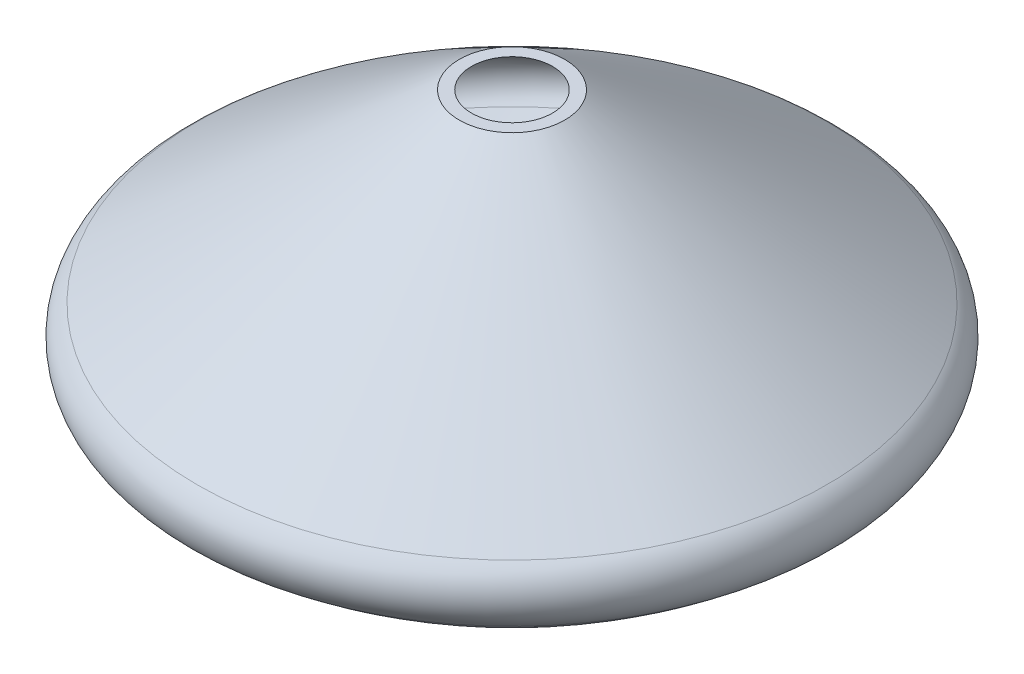
ISO-10303-21;
HEADER;
FILE_DESCRIPTION(('STEP AP214'),'2;1');
FILE_NAME('part.step','',(''),(''),'','','');
FILE_SCHEMA(('AUTOMOTIVE_DESIGN { 1 0 10303 214 1 1 1 1 }'));
ENDSEC;
DATA;
#1=APPLICATION_CONTEXT('core data for automotive mechanical design processes');
#2=APPLICATION_PROTOCOL_DEFINITION('international standard','automotive_design',2000,#1);
#3=PRODUCT_CONTEXT('',#1,'mechanical');
#4=PRODUCT('Part','Part','',(#3));
#5=PRODUCT_RELATED_PRODUCT_CATEGORY('part','',(#4));
#6=PRODUCT_DEFINITION_FORMATION('','',#4);
#7=PRODUCT_DEFINITION_CONTEXT('part definition',#1,'design');
#8=PRODUCT_DEFINITION('design','',#6,#7);
#9=PRODUCT_DEFINITION_SHAPE('','',#8);
#10=(LENGTH_UNIT() NAMED_UNIT(*) SI_UNIT(.MILLI.,.METRE.));
#11=(NAMED_UNIT(*) PLANE_ANGLE_UNIT() SI_UNIT($,.RADIAN.));
#12=(NAMED_UNIT(*) SI_UNIT($,.STERADIAN.) SOLID_ANGLE_UNIT());
#13=UNCERTAINTY_MEASURE_WITH_UNIT(LENGTH_MEASURE(1.E-05),#10,'distance_accuracy_value','');
#14=(GEOMETRIC_REPRESENTATION_CONTEXT(3) GLOBAL_UNCERTAINTY_ASSIGNED_CONTEXT((#13)) GLOBAL_UNIT_ASSIGNED_CONTEXT((#10,
#11,#12)) REPRESENTATION_CONTEXT('',''));
#15=CARTESIAN_POINT('',(0.,0.,0.));
#16=DIRECTION('',(0.,0.,1.));
#17=DIRECTION('',(1.,0.,0.));
#18=AXIS2_PLACEMENT_3D('',#15,#16,#17);
#19=CARTESIAN_POINT('',(0.,0.,0.));
#20=DIRECTION('',(0.,-1.,0.));
#21=DIRECTION('',(0.,0.,-1.));
#22=AXIS2_PLACEMENT_3D('',#19,#20,#21);
#23=PLANE('',#22);
#24=CARTESIAN_POINT('',(0.,0.,0.));
#25=DIRECTION('',(0.,-1.,0.));
#26=DIRECTION('',(0.,0.,-1.));
#27=AXIS2_PLACEMENT_3D('',#24,#25,#26);
#28=CIRCLE('',#27,11.5303818958497);
#29=CARTESIAN_POINT('',(0.,0.,-11.5303818958497));
#30=VERTEX_POINT('',#29);
#31=EDGE_CURVE('E67',#30,#30,#28,.T.);
#32=ORIENTED_EDGE('',*,*,#31,.T.);
#33=EDGE_LOOP('',(#32));
#34=FACE_BOUND('',#33,.T.);
#35=CARTESIAN_POINT('',(0.,0.,0.));
#36=DIRECTION('',(0.,-1.,0.));
#37=DIRECTION('',(0.,0.,-1.));
#38=AXIS2_PLACEMENT_3D('',#35,#36,#37);
#39=CIRCLE('',#38,15.);
#40=CARTESIAN_POINT('',(0.,0.,-15.));
#41=VERTEX_POINT('',#40);
#42=EDGE_CURVE('E11',#41,#41,#39,.T.);
#43=ORIENTED_EDGE('',*,*,#42,.F.);
#44=EDGE_LOOP('',(#43));
#45=FACE_BOUND('',#44,.T.);
#46=ADVANCED_FACE('F41',(#34,#45),#23,.F.);
#47=CARTESIAN_POINT('',(0.,0.,0.));
#48=DIRECTION('',(0.,-1.,0.));
#49=DIRECTION('',(0.,0.,-1.));
#50=AXIS2_PLACEMENT_3D('',#47,#48,#49);
#51=CONICAL_SURFACE('',#50,15.,0.956440430092898);
#52=CARTESIAN_POINT('',(0.,-52.6207460840532,0.));
#53=DIRECTION('',(0.,-1.,0.));
#54=DIRECTION('',(0.,0.,-1.));
#55=AXIS2_PLACEMENT_3D('',#52,#53,#54);
#56=CIRCLE('',#55,89.5946627262082);
#57=CARTESIAN_POINT('',(0.,-52.6207460840532,-89.5946627262082));
#58=VERTEX_POINT('',#57);
#59=EDGE_CURVE('E48',#58,#58,#56,.T.);
#60=CARTESIAN_POINT('',(0.,-52.6207460840532,-89.5946627262082));
#61=CARTESIAN_POINT('',(0.,-52.0726133123443,-88.8176349894768));
#62=CARTESIAN_POINT('',(0.,-51.5244805406354,-88.0406072527455));
#63=CARTESIAN_POINT('',(0.,-50.4282149972177,-86.4865517792828));
#64=CARTESIAN_POINT('',(0.,-49.8800822255088,-85.7095240425515));
#65=CARTESIAN_POINT('',(0.,-48.783816682091,-84.1554685690888));
#66=CARTESIAN_POINT('',(0.,-48.2356839103821,-83.3784408323575));
#67=CARTESIAN_POINT('',(0.,-47.1394183669643,-81.8243853588948));
#68=CARTESIAN_POINT('',(0.,-46.5912855952554,-81.0473576221635));
#69=CARTESIAN_POINT('',(0.,-45.4950200518377,-79.4933021487008));
#70=CARTESIAN_POINT('',(0.,-44.9468872801288,-78.7162744119695));
#71=CARTESIAN_POINT('',(0.,-43.850621736711,-77.1622189385068));
#72=CARTESIAN_POINT('',(0.,-43.3024889650021,-76.3851912017755));
#73=CARTESIAN_POINT('',(0.,-42.2062234215843,-74.8311357283128));
#74=CARTESIAN_POINT('',(0.,-41.6580906498755,-74.0541079915815));
#75=CARTESIAN_POINT('',(0.,-40.5618251064577,-72.5000525181188));
#76=CARTESIAN_POINT('',(0.,-40.0136923347488,-71.7230247813875));
#77=CARTESIAN_POINT('',(0.,-38.917426791331,-70.1689693079248));
#78=CARTESIAN_POINT('',(0.,-38.3692940196221,-69.3919415711935));
#79=CARTESIAN_POINT('',(0.,-37.2730284762044,-67.8378860977308));
#80=CARTESIAN_POINT('',(0.,-36.7248957044955,-67.0608583609994));
#81=CARTESIAN_POINT('',(0.,-35.6286301610777,-65.5068028875368));
#82=CARTESIAN_POINT('',(0.,-35.0804973893688,-64.7297751508055));
#83=CARTESIAN_POINT('',(0.,-33.984231845951,-63.1757196773428));
#84=CARTESIAN_POINT('',(0.,-33.4360990742421,-62.3986919406114));
#85=CARTESIAN_POINT('',(0.,-32.3398335308244,-60.8446364671488));
#86=CARTESIAN_POINT('',(0.,-31.7917007591155,-60.0676087304174));
#87=CARTESIAN_POINT('',(0.,-30.6954352156977,-58.5135532569548));
#88=CARTESIAN_POINT('',(0.,-30.1473024439888,-57.7365255202234));
#89=CARTESIAN_POINT('',(0.,-29.051036900571,-56.1824700467608));
#90=CARTESIAN_POINT('',(0.,-28.5029041288622,-55.4054423100294));
#91=CARTESIAN_POINT('',(0.,-27.4066385854444,-53.8513868365668));
#92=CARTESIAN_POINT('',(0.,-26.8585058137355,-53.0743590998354));
#93=CARTESIAN_POINT('',(0.,-25.7622402703177,-51.5203036263728));
#94=CARTESIAN_POINT('',(0.,-25.2141074986088,-50.7432758896414));
#95=CARTESIAN_POINT('',(0.,-24.1178419551911,-49.1892204161787));
#96=CARTESIAN_POINT('',(0.,-23.5697091834822,-48.4121926794474));
#97=CARTESIAN_POINT('',(0.,-22.4734436400644,-46.8581372059847));
#98=CARTESIAN_POINT('',(0.,-21.9253108683555,-46.0811094692534));
#99=CARTESIAN_POINT('',(0.,-20.8290453249377,-44.5270539957907));
#100=CARTESIAN_POINT('',(0.,-20.2809125532288,-43.7500262590594));
#101=CARTESIAN_POINT('',(0.,-19.1846470098111,-42.1959707855967));
#102=CARTESIAN_POINT('',(0.,-18.6365142381022,-41.4189430488654));
#103=CARTESIAN_POINT('',(0.,-17.5402486946844,-39.8648875754027));
#104=CARTESIAN_POINT('',(0.,-16.9921159229755,-39.0878598386714));
#105=CARTESIAN_POINT('',(0.,-15.8958503795577,-37.5338043652087));
#106=CARTESIAN_POINT('',(0.,-15.3477176078489,-36.7567766284774));
#107=CARTESIAN_POINT('',(0.,-14.2514520644311,-35.2027211550147));
#108=CARTESIAN_POINT('',(0.,-13.7033192927222,-34.4256934182834));
#109=CARTESIAN_POINT('',(0.,-12.6070537493044,-32.8716379448207));
#110=CARTESIAN_POINT('',(0.,-12.0589209775955,-32.0946102080894));
#111=CARTESIAN_POINT('',(0.,-10.9626554341777,-30.5405547346267));
#112=CARTESIAN_POINT('',(0.,-10.4145226624689,-29.7635269978954));
#113=CARTESIAN_POINT('',(0.,-9.31825711905109,-28.2094715244327));
#114=CARTESIAN_POINT('',(0.,-8.7701243473422,-27.4324437877014));
#115=CARTESIAN_POINT('',(0.,-7.67385880392443,-25.8783883142387));
#116=CARTESIAN_POINT('',(0.,-7.12572603221554,-25.1013605775074));
#117=CARTESIAN_POINT('',(0.,-6.02946048879776,-23.5473051040447));
#118=CARTESIAN_POINT('',(0.,-5.48132771708887,-22.7702773673133));
#119=CARTESIAN_POINT('',(0.,-4.3850621736711,-21.2162218938507));
#120=CARTESIAN_POINT('',(0.,-3.83692940196221,-20.4391941571193));
#121=CARTESIAN_POINT('',(0.,-2.74066385854444,-18.8851386836567));
#122=CARTESIAN_POINT('',(0.,-2.19253108683555,-18.1081109469253));
#123=CARTESIAN_POINT('',(0.,-1.09626554341778,-16.5540554734627));
#124=CARTESIAN_POINT('',(0.,-0.548132771708889,-15.7770277367313));
#125=CARTESIAN_POINT('',(0.,0.,-15.));
#126=B_SPLINE_CURVE_WITH_KNOTS('',3,(#60,#61,#62,#63,#64,#65,#66,#67,#68,#69,#70,#71,#72,#73,
#74,#75,#76,#77,#78,#79,#80,#81,#82,#83,#84,#85,#86,#87,#88,#89,#90,#91,#92,#93,#94,#95,#96,#97,
#98,#99,#100,#101,#102,#103,#104,#105,#106,#107,#108,#109,#110,#111,#112,#113,#114,#115,#116,
#117,#118,#119,#120,#121,#122,#123,#124,#125),.UNSPECIFIED.,.F.,.F.,(4,2,2,2,2,2,2,2,2,2,2,2,2,
2,2,2,2,2,2,2,2,2,2,2,2,2,2,2,2,2,2,2,4),(0.,2.85271708229887,5.70543416459775,8.55815124689661,
11.4108683291955,14.2635854114944,17.1163024937932,19.9690195760921,22.821736658391,
25.6744537406899,28.5271708229887,31.3798879052876,34.2326049875865,37.0853220698854,
39.9380391521842,42.7907562344831,45.643473316782,48.4961903990808,51.3489074813797,
54.2016245636786,57.0543416459775,59.9070587282763,62.7597758105752,65.6124928928741,
68.465209975173,71.3179270574718,74.1706441397707,77.0233612220696,79.8760783043684,
82.7287953866673,85.5815124689662,88.4342295512651,91.2869466335639),.UNSPECIFIED.);
#127=EDGE_CURVE('BSEAM76',#58,#41,#126,.T.);
#128=ORIENTED_EDGE('',*,*,#59,.F.);
#129=ORIENTED_EDGE('',*,*,#42,.T.);
#130=ORIENTED_EDGE('',*,*,#127,.T.);
#131=ORIENTED_EDGE('',*,*,#127,.F.);
#132=EDGE_LOOP('',(#128,#130,#129,#131));
#133=FACE_BOUND('',#132,.T.);
#134=ADVANCED_FACE('F76',(#133),#51,.T.);
#135=CARTESIAN_POINT('',(0.,-60.7921950674045,0.));
#136=DIRECTION('',(0.,-1.,0.));
#137=DIRECTION('',(0.,0.,-1.));
#138=AXIS2_PLACEMENT_3D('',#135,#136,#137);
#139=TOROIDAL_SURFACE('',#138,83.8303395645103,10.);
#140=CARTESIAN_POINT('',(0.,-68.5697034481005,0.));
#141=DIRECTION('',(0.,-1.,0.));
#142=DIRECTION('',(0.,0.,-1.));
#143=AXIS2_PLACEMENT_3D('',#140,#141,#142);
#144=CIRCLE('',#143,90.1160665223254);
#145=CARTESIAN_POINT('',(0.,-68.5697034481005,-90.1160665223254));
#146=VERTEX_POINT('',#145);
#147=EDGE_CURVE('E73',#146,#146,#144,.T.);
#148=ORIENTED_EDGE('',*,*,#147,.F.);
#149=EDGE_LOOP('',(#148));
#150=FACE_BOUND('',#149,.T.);
#151=ORIENTED_EDGE('',*,*,#59,.T.);
#152=EDGE_LOOP('',(#151));
#153=FACE_BOUND('',#152,.T.);
#154=ADVANCED_FACE('F77',(#150,#153),#139,.T.);
#155=CARTESIAN_POINT('',(0.,44.2041680719914,1.02697436599356));
#156=DIRECTION('',(-1.,0.,0.));
#157=DIRECTION('',(0.,0.,-1.));
#158=AXIS2_PLACEMENT_3D('',#155,#156,#157);
#159=CIRCLE('',#158,145.);
#160=TRIMMED_CURVE('',#159,(PARAMETER_VALUE(-1.56371368574524)),
(PARAMETER_VALUE(1.56371368574524)),.T.,.PARAMETER.);
#161=CARTESIAN_POINT('',(0.,44.2041680719914,0.));
#162=DIRECTION('',(0.,-1.,0.));
#163=AXIS1_PLACEMENT('',#161,#162);
#164=SURFACE_OF_REVOLUTION('',#160,#163);
#165=CARTESIAN_POINT('',(0.,-100.792195067405,0.));
#166=VERTEX_POINT('',#165);
#167=VERTEX_LOOP('',#166);
#168=FACE_BOUND('',#167,.T.);
#169=ORIENTED_EDGE('',*,*,#147,.T.);
#170=EDGE_LOOP('',(#169));
#171=FACE_BOUND('',#170,.T.);
#172=ADVANCED_FACE('F95',(#168,#171),#164,.T.);
#173=CARTESIAN_POINT('',(0.,-1.63428979667026,0.));
#174=DIRECTION('',(0.,-1.,0.));
#175=DIRECTION('',(0.,0.,-1.));
#176=AXIS2_PLACEMENT_3D('',#173,#174,#175);
#177=CONICAL_SURFACE('',#176,13.8471353676604,0.956440430092898);
#178=CARTESIAN_POINT('',(0.,-54.2550358807234,0.));
#179=DIRECTION('',(0.,-1.,0.));
#180=DIRECTION('',(0.,0.,-1.));
#181=AXIS2_PLACEMENT_3D('',#178,#179,#180);
#182=CIRCLE('',#181,88.4417980938686);
#183=CARTESIAN_POINT('',(0.,-54.2550358807234,-88.4417980938686));
#184=VERTEX_POINT('',#183);
#185=EDGE_CURVE('E65',#184,#184,#182,.T.);
#186=CARTESIAN_POINT('',(0.,-54.2550358807234,-88.4417980938686));
#187=CARTESIAN_POINT('',(0.,-53.6898792569659,-87.6406375084725));
#188=CARTESIAN_POINT('',(0.,-53.1247226332084,-86.8394769230765));
#189=CARTESIAN_POINT('',(0.,-51.9944093856933,-85.2371557522844));
#190=CARTESIAN_POINT('',(0.,-51.4292527619358,-84.4359951668884));
#191=CARTESIAN_POINT('',(0.,-50.2989395144207,-82.8336739960964));
#192=CARTESIAN_POINT('',(0.,-49.7337828906632,-82.0325134107003));
#193=CARTESIAN_POINT('',(0.,-48.6034696431481,-80.4301922399083));
#194=CARTESIAN_POINT('',(0.,-48.0383130193905,-79.6290316545122));
#195=CARTESIAN_POINT('',(0.,-46.9079997718755,-78.0267104837202));
#196=CARTESIAN_POINT('',(0.,-46.3428431481179,-77.2255498983241));
#197=CARTESIAN_POINT('',(0.,-45.2125299006029,-75.6232287275321));
#198=CARTESIAN_POINT('',(0.,-44.6473732768453,-74.822068142136));
#199=CARTESIAN_POINT('',(0.,-43.5170600293303,-73.219746971344));
#200=CARTESIAN_POINT('',(0.,-42.9519034055727,-72.418586385948));
#201=CARTESIAN_POINT('',(0.,-41.8215901580576,-70.8162652151559));
#202=CARTESIAN_POINT('',(0.,-41.2564335343001,-70.0151046297599));
#203=CARTESIAN_POINT('',(0.,-40.126120286785,-68.4127834589678));
#204=CARTESIAN_POINT('',(0.,-39.5609636630275,-67.6116228735718));
#205=CARTESIAN_POINT('',(0.,-38.4306504155124,-66.0093017027797));
#206=CARTESIAN_POINT('',(0.,-37.8654937917549,-65.2081411173837));
#207=CARTESIAN_POINT('',(0.,-36.7351805442398,-63.6058199465916));
#208=CARTESIAN_POINT('',(0.,-36.1700239204823,-62.8046593611956));
#209=CARTESIAN_POINT('',(0.,-35.0397106729672,-61.2023381904035));
#210=CARTESIAN_POINT('',(0.,-34.4745540492097,-60.4011776050075));
#211=CARTESIAN_POINT('',(0.,-33.3442408016946,-58.7988564342154));
#212=CARTESIAN_POINT('',(0.,-32.7790841779371,-57.9976958488194));
#213=CARTESIAN_POINT('',(0.,-31.648770930422,-56.3953746780274));
#214=CARTESIAN_POINT('',(0.,-31.0836143066645,-55.5942140926313));
#215=CARTESIAN_POINT('',(0.,-29.9533010591494,-53.9918929218393));
#216=CARTESIAN_POINT('',(0.,-29.3881444353919,-53.1907323364432));
#217=CARTESIAN_POINT('',(0.,-28.2578311878768,-51.5884111656512));
#218=CARTESIAN_POINT('',(0.,-27.6926745641193,-50.7872505802551));
#219=CARTESIAN_POINT('',(0.,-26.5623613166042,-49.1849294094631));
#220=CARTESIAN_POINT('',(0.,-25.9972046928466,-48.3837688240671));
#221=CARTESIAN_POINT('',(0.,-24.8668914453316,-46.781447653275));
#222=CARTESIAN_POINT('',(0.,-24.301734821574,-45.980287067879));
#223=CARTESIAN_POINT('',(0.,-23.171421574059,-44.3779658970869));
#224=CARTESIAN_POINT('',(0.,-22.6062649503014,-43.5768053116909));
#225=CARTESIAN_POINT('',(0.,-21.4759517027864,-41.9744841408988));
#226=CARTESIAN_POINT('',(0.,-20.9107950790288,-41.1733235555028));
#227=CARTESIAN_POINT('',(0.,-19.7804818315138,-39.5710023847107));
#228=CARTESIAN_POINT('',(0.,-19.2153252077562,-38.7698417993147));
#229=CARTESIAN_POINT('',(0.,-18.0850119602411,-37.1675206285226));
#230=CARTESIAN_POINT('',(0.,-17.5198553364836,-36.3663600431266));
#231=CARTESIAN_POINT('',(0.,-16.3895420889685,-34.7640388723345));
#232=CARTESIAN_POINT('',(0.,-15.824385465211,-33.9628782869385));
#233=CARTESIAN_POINT('',(0.,-14.6940722176959,-32.3605571161465));
#234=CARTESIAN_POINT('',(0.,-14.1289155939384,-31.5593965307504));
#235=CARTESIAN_POINT('',(0.,-12.9986023464233,-29.9570753599584));
#236=CARTESIAN_POINT('',(0.,-12.4334457226658,-29.1559147745623));
#237=CARTESIAN_POINT('',(0.,-11.3031324751507,-27.5535936037703));
#238=CARTESIAN_POINT('',(0.,-10.7379758513932,-26.7524330183742));
#239=CARTESIAN_POINT('',(0.,-9.6076626038781,-25.1501118475822));
#240=CARTESIAN_POINT('',(0.,-9.04250598012057,-24.3489512621862));
#241=CARTESIAN_POINT('',(0.,-7.9121927326055,-22.7466300913941));
#242=CARTESIAN_POINT('',(0.,-7.34703610884796,-21.9454695059981));
#243=CARTESIAN_POINT('',(0.,-6.21672286133289,-20.343148335206));
#244=CARTESIAN_POINT('',(0.,-5.65156623757535,-19.54198774981));
#245=CARTESIAN_POINT('',(0.,-4.52125299006028,-17.9396665790179));
#246=CARTESIAN_POINT('',(0.,-3.95609636630275,-17.1385059936219));
#247=CARTESIAN_POINT('',(0.,-2.82578311878767,-15.5361848228298));
#248=CARTESIAN_POINT('',(0.,-2.26062649503014,-14.7350242374338));
#249=CARTESIAN_POINT('',(0.,-1.13031324751507,-13.1327030666417));
#250=CARTESIAN_POINT('',(0.,-0.565156623757531,-12.3315424812457));
#251=CARTESIAN_POINT('',(0.,0.,-11.5303818958497));
#252=B_SPLINE_CURVE_WITH_KNOTS('',3,(#186,#187,#188,#189,#190,#191,#192,#193,#194,#195,#196,
#197,#198,#199,#200,#201,#202,#203,#204,#205,#206,#207,#208,#209,#210,#211,#212,#213,#214,#215,
#216,#217,#218,#219,#220,#221,#222,#223,#224,#225,#226,#227,#228,#229,#230,#231,#232,#233,#234,
#235,#236,#237,#238,#239,#240,#241,#242,#243,#244,#245,#246,#247,#248,#249,#250,#251),
.UNSPECIFIED.,.F.,.F.,(4,2,2,2,2,2,2,2,2,2,2,2,2,2,2,2,2,2,2,2,2,2,2,2,2,2,2,2,2,2,2,2,4),(0.,
2.94131648020443,5.88263296040885,8.82394944061328,11.7652659208177,14.7065824010221,
17.6478988812266,20.589215361431,23.5305318416354,26.4718483218398,29.4131648020442,
32.3544812822487,35.2957977624531,38.2371142426575,41.1784307228619,44.1197472030664,
47.0610636832708,50.0023801634752,52.9436966436796,55.8850131238841,58.8263296040885,
61.7676460842929,64.7089625644973,67.6502790447017,70.5915955249062,73.5329120051106,
76.474228485315,79.4155449655194,82.3568614457238,85.2981779259283,88.2394944061327,
91.1808108863371,94.1221273665415),.UNSPECIFIED.);
#253=EDGE_CURVE('BSEAM93',#184,#30,#252,.T.);
#254=ORIENTED_EDGE('',*,*,#185,.T.);
#255=ORIENTED_EDGE('',*,*,#31,.F.);
#256=ORIENTED_EDGE('',*,*,#253,.T.);
#257=ORIENTED_EDGE('',*,*,#253,.F.);
#258=EDGE_LOOP('',(#254,#256,#255,#257));
#259=FACE_BOUND('',#258,.T.);
#260=ADVANCED_FACE('F93',(#259),#177,.F.);
#261=CARTESIAN_POINT('',(0.,-60.7921950674045,0.));
#262=DIRECTION('',(0.,-1.,0.));
#263=DIRECTION('',(0.,0.,-1.));
#264=AXIS2_PLACEMENT_3D('',#261,#262,#263);
#265=TOROIDAL_SURFACE('',#264,83.8303395645103,8.00000000000003);
#266=CARTESIAN_POINT('',(0.,-67.0142017719613,0.));
#267=DIRECTION('',(0.,-1.,0.));
#268=DIRECTION('',(0.,0.,-1.));
#269=AXIS2_PLACEMENT_3D('',#266,#267,#268);
#270=CIRCLE('',#269,88.8589211307624);
#271=CARTESIAN_POINT('',(0.,-67.0142017719613,-88.8589211307624));
#272=VERTEX_POINT('',#271);
#273=EDGE_CURVE('E64',#272,#272,#270,.T.);
#274=ORIENTED_EDGE('',*,*,#273,.T.);
#275=EDGE_LOOP('',(#274));
#276=FACE_BOUND('',#275,.T.);
#277=ORIENTED_EDGE('',*,*,#185,.F.);
#278=EDGE_LOOP('',(#277));
#279=FACE_BOUND('',#278,.T.);
#280=ADVANCED_FACE('F60',(#276,#279),#265,.F.);
#281=CARTESIAN_POINT('',(0.,44.2041680719914,1.02697436599356));
#282=DIRECTION('',(-1.,0.,0.));
#283=DIRECTION('',(0.,0.,-1.));
#284=AXIS2_PLACEMENT_3D('',#281,#282,#283);
#285=CIRCLE('',#284,143.);
#286=TRIMMED_CURVE('',#285,(PARAMETER_VALUE(-1.56361462613714)),
(PARAMETER_VALUE(1.56361462613714)),.T.,.PARAMETER.);
#287=CARTESIAN_POINT('',(0.,44.2041680719914,0.));
#288=DIRECTION('',(0.,-1.,0.));
#289=AXIS1_PLACEMENT('',#287,#288);
#290=SURFACE_OF_REVOLUTION('',#286,#289);
#291=CARTESIAN_POINT('',(0.,-98.7921442009185,0.));
#292=VERTEX_POINT('',#291);
#293=VERTEX_LOOP('',#292);
#294=FACE_BOUND('',#293,.T.);
#295=ORIENTED_EDGE('',*,*,#273,.F.);
#296=EDGE_LOOP('',(#295));
#297=FACE_BOUND('',#296,.T.);
#298=ADVANCED_FACE('F53',(#294,#297),#290,.F.);
#299=CLOSED_SHELL('',(#46,#134,#154,#172,#260,#280,#298));
#300=MANIFOLD_SOLID_BREP('B2',#299);
#301=ADVANCED_BREP_SHAPE_REPRESENTATION('',(#18,#300),#14);
#302=SHAPE_DEFINITION_REPRESENTATION(#9,#301);
ENDSEC;
END-ISO-10303-21;
